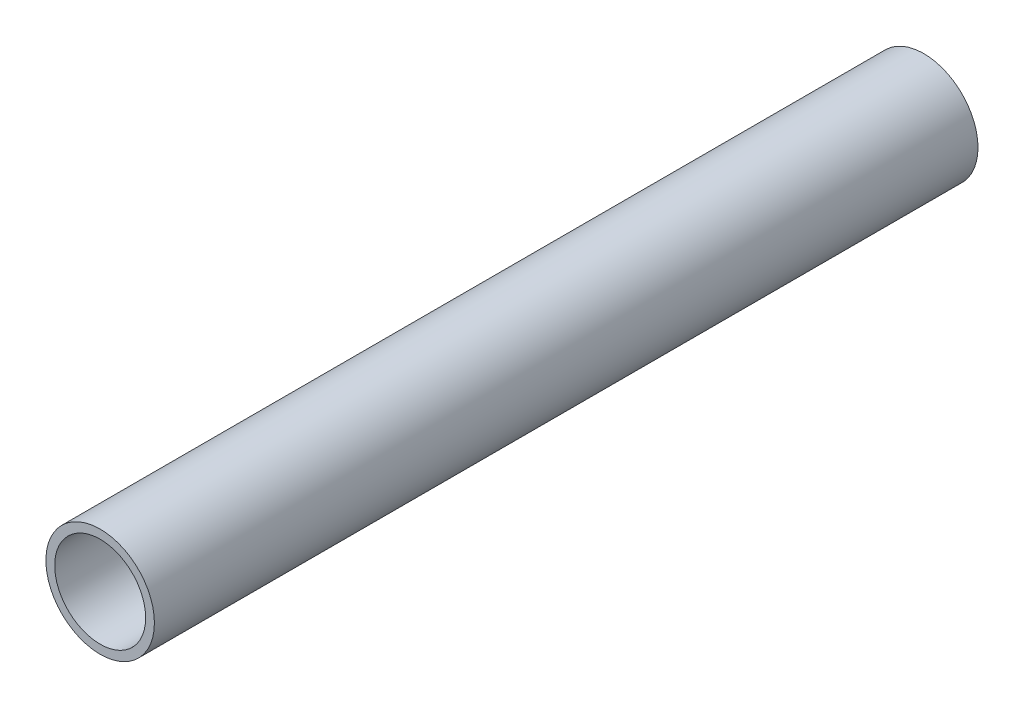
ISO-10303-21;
HEADER;
FILE_DESCRIPTION(('STEP AP214'),'2;1');
FILE_NAME('part.step','',(''),(''),'','','');
FILE_SCHEMA(('AUTOMOTIVE_DESIGN { 1 0 10303 214 1 1 1 1 }'));
ENDSEC;
DATA;
#1=APPLICATION_CONTEXT('core data for automotive mechanical design processes');
#2=APPLICATION_PROTOCOL_DEFINITION('international standard','automotive_design',2000,#1);
#3=PRODUCT_CONTEXT('',#1,'mechanical');
#4=PRODUCT('Part','Part','',(#3));
#5=PRODUCT_RELATED_PRODUCT_CATEGORY('part','',(#4));
#6=PRODUCT_DEFINITION_FORMATION('','',#4);
#7=PRODUCT_DEFINITION_CONTEXT('part definition',#1,'design');
#8=PRODUCT_DEFINITION('design','',#6,#7);
#9=PRODUCT_DEFINITION_SHAPE('','',#8);
#10=(LENGTH_UNIT() NAMED_UNIT(*) SI_UNIT(.MILLI.,.METRE.));
#11=(NAMED_UNIT(*) PLANE_ANGLE_UNIT() SI_UNIT($,.RADIAN.));
#12=(NAMED_UNIT(*) SI_UNIT($,.STERADIAN.) SOLID_ANGLE_UNIT());
#13=UNCERTAINTY_MEASURE_WITH_UNIT(LENGTH_MEASURE(1.E-05),#10,'distance_accuracy_value','');
#14=(GEOMETRIC_REPRESENTATION_CONTEXT(3) GLOBAL_UNCERTAINTY_ASSIGNED_CONTEXT((#13)) GLOBAL_UNIT_ASSIGNED_CONTEXT((#10,
#11,#12)) REPRESENTATION_CONTEXT('',''));
#15=CARTESIAN_POINT('',(0.,0.,0.));
#16=DIRECTION('',(0.,0.,1.));
#17=DIRECTION('',(1.,0.,0.));
#18=AXIS2_PLACEMENT_3D('',#15,#16,#17);
#19=CARTESIAN_POINT('',(0.,0.,460.));
#20=DIRECTION('',(0.,0.,1.));
#21=DIRECTION('',(1.,0.,0.));
#22=AXIS2_PLACEMENT_3D('',#19,#20,#21);
#23=PLANE('',#22);
#24=CARTESIAN_POINT('',(0.,0.,460.));
#25=DIRECTION('',(0.,0.,1.));
#26=DIRECTION('',(1.,0.,0.));
#27=AXIS2_PLACEMENT_3D('',#24,#25,#26);
#28=CIRCLE('',#27,30.3);
#29=CARTESIAN_POINT('',(30.3,0.,460.));
#30=VERTEX_POINT('',#29);
#31=EDGE_CURVE('E10',#30,#30,#28,.T.);
#32=ORIENTED_EDGE('',*,*,#31,.T.);
#33=EDGE_LOOP('',(#32));
#34=FACE_BOUND('',#33,.T.);
#35=CARTESIAN_POINT('',(0.,0.,460.));
#36=DIRECTION('',(0.,0.,1.));
#37=DIRECTION('',(1.,0.,0.));
#38=AXIS2_PLACEMENT_3D('',#35,#36,#37);
#39=CIRCLE('',#38,25.4);
#40=CARTESIAN_POINT('',(25.4,0.,460.));
#41=VERTEX_POINT('',#40);
#42=EDGE_CURVE('E54',#41,#41,#39,.T.);
#43=ORIENTED_EDGE('',*,*,#42,.F.);
#44=EDGE_LOOP('',(#43));
#45=FACE_BOUND('',#44,.T.);
#46=ADVANCED_FACE('F41',(#34,#45),#23,.T.);
#47=CARTESIAN_POINT('',(0.,0.,0.));
#48=DIRECTION('',(0.,0.,1.));
#49=DIRECTION('',(1.,0.,0.));
#50=AXIS2_PLACEMENT_3D('',#47,#48,#49);
#51=PLANE('',#50);
#52=CARTESIAN_POINT('',(0.,0.,0.));
#53=DIRECTION('',(0.,0.,1.));
#54=DIRECTION('',(1.,0.,0.));
#55=AXIS2_PLACEMENT_3D('',#52,#53,#54);
#56=CIRCLE('',#55,30.3);
#57=CARTESIAN_POINT('',(30.3,0.,0.));
#58=VERTEX_POINT('',#57);
#59=EDGE_CURVE('E45',#58,#58,#56,.T.);
#60=ORIENTED_EDGE('',*,*,#59,.F.);
#61=EDGE_LOOP('',(#60));
#62=FACE_BOUND('',#61,.T.);
#63=CARTESIAN_POINT('',(0.,0.,0.));
#64=DIRECTION('',(0.,0.,1.));
#65=DIRECTION('',(1.,0.,0.));
#66=AXIS2_PLACEMENT_3D('',#63,#64,#65);
#67=CIRCLE('',#66,25.4);
#68=CARTESIAN_POINT('',(25.4,0.,0.));
#69=VERTEX_POINT('',#68);
#70=EDGE_CURVE('E56',#69,#69,#67,.T.);
#71=ORIENTED_EDGE('',*,*,#70,.T.);
#72=EDGE_LOOP('',(#71));
#73=FACE_BOUND('',#72,.T.);
#74=ADVANCED_FACE('F68',(#62,#73),#51,.F.);
#75=CARTESIAN_POINT('',(0.,0.,460.));
#76=DIRECTION('',(0.,0.,-1.));
#77=DIRECTION('',(-1.,0.,0.));
#78=AXIS2_PLACEMENT_3D('',#75,#76,#77);
#79=CYLINDRICAL_SURFACE('',#78,30.3);
#80=ORIENTED_EDGE('',*,*,#31,.F.);
#81=EDGE_LOOP('',(#80));
#82=FACE_BOUND('',#81,.T.);
#83=ORIENTED_EDGE('',*,*,#59,.T.);
#84=EDGE_LOOP('',(#83));
#85=FACE_BOUND('',#84,.T.);
#86=ADVANCED_FACE('F43',(#82,#85),#79,.T.);
#87=CARTESIAN_POINT('',(0.,0.,460.));
#88=DIRECTION('',(0.,0.,-1.));
#89=DIRECTION('',(-1.,0.,0.));
#90=AXIS2_PLACEMENT_3D('',#87,#88,#89);
#91=CYLINDRICAL_SURFACE('',#90,25.4);
#92=ORIENTED_EDGE('',*,*,#42,.T.);
#93=EDGE_LOOP('',(#92));
#94=FACE_BOUND('',#93,.T.);
#95=ORIENTED_EDGE('',*,*,#70,.F.);
#96=EDGE_LOOP('',(#95));
#97=FACE_BOUND('',#96,.T.);
#98=ADVANCED_FACE('F64',(#94,#97),#91,.F.);
#99=CLOSED_SHELL('',(#46,#74,#86,#98));
#100=MANIFOLD_SOLID_BREP('B2',#99);
#101=ADVANCED_BREP_SHAPE_REPRESENTATION('',(#18,#100),#14);
#102=SHAPE_DEFINITION_REPRESENTATION(#9,#101);
ENDSEC;
END-ISO-10303-21;
